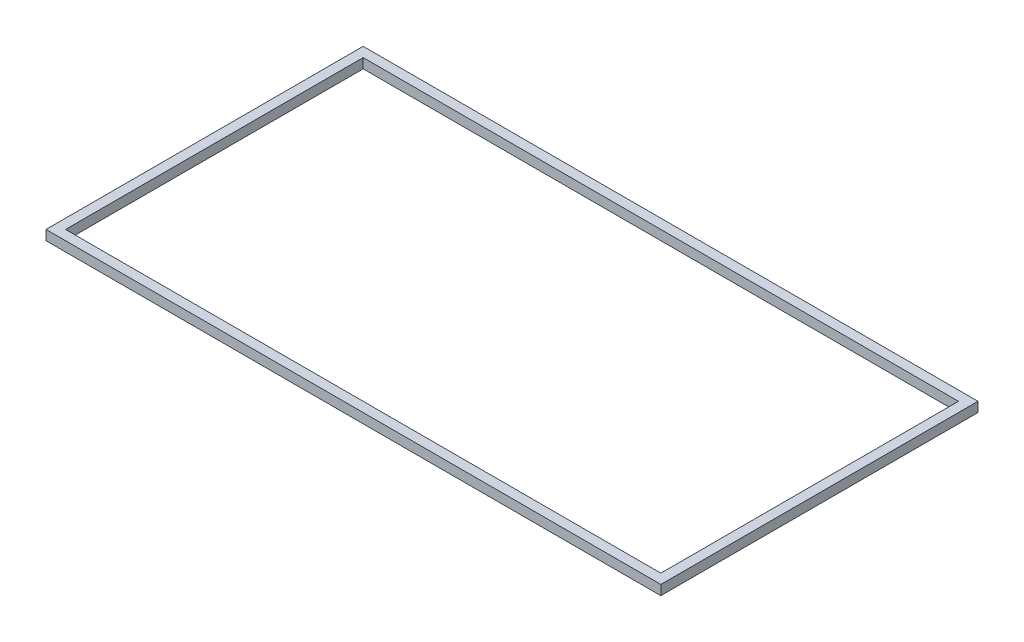
ISO-10303-21;
HEADER;
FILE_DESCRIPTION(('STEP AP214'),'2;1');
FILE_NAME('part.step','',(''),(''),'','','');
FILE_SCHEMA(('AUTOMOTIVE_DESIGN { 1 0 10303 214 1 1 1 1 }'));
ENDSEC;
DATA;
#1=APPLICATION_CONTEXT('core data for automotive mechanical design processes');
#2=APPLICATION_PROTOCOL_DEFINITION('international standard','automotive_design',2000,#1);
#3=PRODUCT_CONTEXT('',#1,'mechanical');
#4=PRODUCT('Part','Part','',(#3));
#5=PRODUCT_RELATED_PRODUCT_CATEGORY('part','',(#4));
#6=PRODUCT_DEFINITION_FORMATION('','',#4);
#7=PRODUCT_DEFINITION_CONTEXT('part definition',#1,'design');
#8=PRODUCT_DEFINITION('design','',#6,#7);
#9=PRODUCT_DEFINITION_SHAPE('','',#8);
#10=(LENGTH_UNIT() NAMED_UNIT(*) SI_UNIT(.MILLI.,.METRE.));
#11=(NAMED_UNIT(*) PLANE_ANGLE_UNIT() SI_UNIT($,.RADIAN.));
#12=(NAMED_UNIT(*) SI_UNIT($,.STERADIAN.) SOLID_ANGLE_UNIT());
#13=UNCERTAINTY_MEASURE_WITH_UNIT(LENGTH_MEASURE(1.E-05),#10,'distance_accuracy_value','');
#14=(GEOMETRIC_REPRESENTATION_CONTEXT(3) GLOBAL_UNCERTAINTY_ASSIGNED_CONTEXT((#13)) GLOBAL_UNIT_ASSIGNED_CONTEXT((#10,
#11,#12)) REPRESENTATION_CONTEXT('',''));
#15=CARTESIAN_POINT('',(0.,0.,0.));
#16=DIRECTION('',(0.,0.,1.));
#17=DIRECTION('',(1.,0.,0.));
#18=AXIS2_PLACEMENT_3D('',#15,#16,#17);
#19=CARTESIAN_POINT('',(0.,10.,0.));
#20=DIRECTION('',(0.,1.,0.));
#21=DIRECTION('',(0.,0.,1.));
#22=AXIS2_PLACEMENT_3D('',#19,#20,#21);
#23=PLANE('',#22);
#24=DIRECTION('',(0.,0.,-1.));
#25=VECTOR('',#24,1.);
#26=CARTESIAN_POINT('',(314.8,10.,0.));
#27=LINE('',#26,#25);
#28=CARTESIAN_POINT('',(314.8,10.,162.4));
#29=VERTEX_POINT('',#28);
#30=CARTESIAN_POINT('',(314.8,10.,-162.4));
#31=VERTEX_POINT('',#30);
#32=EDGE_CURVE('E182',#29,#31,#27,.T.);
#33=ORIENTED_EDGE('',*,*,#32,.T.);
#34=DIRECTION('',(-1.,0.,0.));
#35=VECTOR('',#34,1.);
#36=CARTESIAN_POINT('',(0.,10.,-162.4));
#37=LINE('',#36,#35);
#38=CARTESIAN_POINT('',(-314.8,10.,-162.4));
#39=VERTEX_POINT('',#38);
#40=EDGE_CURVE('E186',#31,#39,#37,.T.);
#41=ORIENTED_EDGE('',*,*,#40,.T.);
#42=DIRECTION('',(0.,0.,1.));
#43=VECTOR('',#42,1.);
#44=CARTESIAN_POINT('',(-314.8,10.,0.));
#45=LINE('',#44,#43);
#46=CARTESIAN_POINT('',(-314.8,10.,162.4));
#47=VERTEX_POINT('',#46);
#48=EDGE_CURVE('E190',#39,#47,#45,.T.);
#49=ORIENTED_EDGE('',*,*,#48,.T.);
#50=DIRECTION('',(1.,0.,0.));
#51=VECTOR('',#50,1.);
#52=CARTESIAN_POINT('',(0.,10.,162.4));
#53=LINE('',#52,#51);
#54=EDGE_CURVE('E193',#47,#29,#53,.T.);
#55=ORIENTED_EDGE('',*,*,#54,.T.);
#56=EDGE_LOOP('',(#33,#41,#49,#55));
#57=FACE_BOUND('',#56,.T.);
#58=DIRECTION('',(-1.,0.,0.));
#59=VECTOR('',#58,1.);
#60=CARTESIAN_POINT('',(-304.8,10.,-152.4));
#61=LINE('',#60,#59);
#62=CARTESIAN_POINT('',(304.8,10.,-152.4));
#63=VERTEX_POINT('',#62);
#64=CARTESIAN_POINT('',(-304.8,10.,-152.4));
#65=VERTEX_POINT('',#64);
#66=EDGE_CURVE('E143',#63,#65,#61,.T.);
#67=ORIENTED_EDGE('',*,*,#66,.F.);
#68=DIRECTION('',(0.,0.,-1.));
#69=VECTOR('',#68,1.);
#70=CARTESIAN_POINT('',(304.8,10.,152.4));
#71=LINE('',#70,#69);
#72=CARTESIAN_POINT('',(304.8,10.,152.4));
#73=VERTEX_POINT('',#72);
#74=EDGE_CURVE('E134',#73,#63,#71,.T.);
#75=ORIENTED_EDGE('',*,*,#74,.F.);
#76=DIRECTION('',(1.,0.,0.));
#77=VECTOR('',#76,1.);
#78=CARTESIAN_POINT('',(-304.8,10.,152.4));
#79=LINE('',#78,#77);
#80=CARTESIAN_POINT('',(-304.8,10.,152.4));
#81=VERTEX_POINT('',#80);
#82=EDGE_CURVE('E160',#81,#73,#79,.T.);
#83=ORIENTED_EDGE('',*,*,#82,.F.);
#84=DIRECTION('',(0.,0.,1.));
#85=VECTOR('',#84,1.);
#86=CARTESIAN_POINT('',(-304.8,10.,152.4));
#87=LINE('',#86,#85);
#88=EDGE_CURVE('E156',#65,#81,#87,.T.);
#89=ORIENTED_EDGE('',*,*,#88,.F.);
#90=EDGE_LOOP('',(#67,#75,#83,#89));
#91=FACE_BOUND('',#90,.T.);
#92=ADVANCED_FACE('F65',(#57,#91),#23,.T.);
#93=CARTESIAN_POINT('',(0.,0.,0.));
#94=DIRECTION('',(0.,1.,0.));
#95=DIRECTION('',(0.,0.,1.));
#96=AXIS2_PLACEMENT_3D('',#93,#94,#95);
#97=PLANE('',#96);
#98=DIRECTION('',(0.,0.,-1.));
#99=VECTOR('',#98,1.);
#100=CARTESIAN_POINT('',(314.8,0.,0.));
#101=LINE('',#100,#99);
#102=CARTESIAN_POINT('',(314.8,0.,162.4));
#103=VERTEX_POINT('',#102);
#104=CARTESIAN_POINT('',(314.8,0.,-162.4));
#105=VERTEX_POINT('',#104);
#106=EDGE_CURVE('E152',#103,#105,#101,.T.);
#107=ORIENTED_EDGE('',*,*,#106,.F.);
#108=DIRECTION('',(1.,0.,0.));
#109=VECTOR('',#108,1.);
#110=CARTESIAN_POINT('',(0.,0.,162.4));
#111=LINE('',#110,#109);
#112=CARTESIAN_POINT('',(-314.8,0.,162.4));
#113=VERTEX_POINT('',#112);
#114=EDGE_CURVE('E187',#113,#103,#111,.T.);
#115=ORIENTED_EDGE('',*,*,#114,.F.);
#116=DIRECTION('',(0.,0.,1.));
#117=VECTOR('',#116,1.);
#118=CARTESIAN_POINT('',(-314.8,0.,0.));
#119=LINE('',#118,#117);
#120=CARTESIAN_POINT('',(-314.8,0.,-162.4));
#121=VERTEX_POINT('',#120);
#122=EDGE_CURVE('E203',#121,#113,#119,.T.);
#123=ORIENTED_EDGE('',*,*,#122,.F.);
#124=DIRECTION('',(-1.,0.,0.));
#125=VECTOR('',#124,1.);
#126=CARTESIAN_POINT('',(0.,0.,-162.4));
#127=LINE('',#126,#125);
#128=EDGE_CURVE('E200',#105,#121,#127,.T.);
#129=ORIENTED_EDGE('',*,*,#128,.F.);
#130=EDGE_LOOP('',(#107,#115,#123,#129));
#131=FACE_BOUND('',#130,.T.);
#132=DIRECTION('',(0.,0.,-1.));
#133=VECTOR('',#132,1.);
#134=CARTESIAN_POINT('',(304.8,0.,152.4));
#135=LINE('',#134,#133);
#136=CARTESIAN_POINT('',(304.8,0.,152.4));
#137=VERTEX_POINT('',#136);
#138=CARTESIAN_POINT('',(304.8,0.,-152.4));
#139=VERTEX_POINT('',#138);
#140=EDGE_CURVE('E91',#137,#139,#135,.T.);
#141=ORIENTED_EDGE('',*,*,#140,.T.);
#142=DIRECTION('',(-1.,0.,0.));
#143=VECTOR('',#142,1.);
#144=CARTESIAN_POINT('',(-304.8,0.,-152.4));
#145=LINE('',#144,#143);
#146=CARTESIAN_POINT('',(-304.8,0.,-152.4));
#147=VERTEX_POINT('',#146);
#148=EDGE_CURVE('E150',#139,#147,#145,.T.);
#149=ORIENTED_EDGE('',*,*,#148,.T.);
#150=DIRECTION('',(0.,0.,1.));
#151=VECTOR('',#150,1.);
#152=CARTESIAN_POINT('',(-304.8,0.,152.4));
#153=LINE('',#152,#151);
#154=CARTESIAN_POINT('',(-304.8,0.,152.4));
#155=VERTEX_POINT('',#154);
#156=EDGE_CURVE('E169',#147,#155,#153,.T.);
#157=ORIENTED_EDGE('',*,*,#156,.T.);
#158=DIRECTION('',(1.,0.,0.));
#159=VECTOR('',#158,1.);
#160=CARTESIAN_POINT('',(-304.8,0.,152.4));
#161=LINE('',#160,#159);
#162=EDGE_CURVE('E144',#155,#137,#161,.T.);
#163=ORIENTED_EDGE('',*,*,#162,.T.);
#164=EDGE_LOOP('',(#141,#149,#157,#163));
#165=FACE_BOUND('',#164,.T.);
#166=ADVANCED_FACE('F226',(#131,#165),#97,.F.);
#167=CARTESIAN_POINT('',(314.8,10.,0.));
#168=DIRECTION('',(-1.,0.,0.));
#169=DIRECTION('',(0.,0.,1.));
#170=AXIS2_PLACEMENT_3D('',#167,#168,#169);
#171=PLANE('',#170);
#172=ORIENTED_EDGE('',*,*,#106,.T.);
#173=DIRECTION('',(0.,-1.,0.));
#174=VECTOR('',#173,1.);
#175=CARTESIAN_POINT('',(314.8,10.,-162.4));
#176=LINE('',#175,#174);
#177=EDGE_CURVE('E12',#31,#105,#176,.T.);
#178=ORIENTED_EDGE('',*,*,#177,.F.);
#179=ORIENTED_EDGE('',*,*,#32,.F.);
#180=DIRECTION('',(0.,-1.,0.));
#181=VECTOR('',#180,1.);
#182=CARTESIAN_POINT('',(314.8,10.,162.4));
#183=LINE('',#182,#181);
#184=EDGE_CURVE('E196',#29,#103,#183,.T.);
#185=ORIENTED_EDGE('',*,*,#184,.T.);
#186=EDGE_LOOP('',(#172,#178,#179,#185));
#187=FACE_BOUND('',#186,.T.);
#188=ADVANCED_FACE('F67',(#187),#171,.F.);
#189=CARTESIAN_POINT('',(0.,10.,-162.4));
#190=DIRECTION('',(0.,0.,1.));
#191=DIRECTION('',(1.,0.,0.));
#192=AXIS2_PLACEMENT_3D('',#189,#190,#191);
#193=PLANE('',#192);
#194=ORIENTED_EDGE('',*,*,#128,.T.);
#195=DIRECTION('',(0.,-1.,0.));
#196=VECTOR('',#195,1.);
#197=CARTESIAN_POINT('',(-314.8,10.,-162.4));
#198=LINE('',#197,#196);
#199=EDGE_CURVE('E74',#39,#121,#198,.T.);
#200=ORIENTED_EDGE('',*,*,#199,.F.);
#201=ORIENTED_EDGE('',*,*,#40,.F.);
#202=ORIENTED_EDGE('',*,*,#177,.T.);
#203=EDGE_LOOP('',(#194,#200,#201,#202));
#204=FACE_BOUND('',#203,.T.);
#205=ADVANCED_FACE('F236',(#204),#193,.F.);
#206=CARTESIAN_POINT('',(-314.8,10.,0.));
#207=DIRECTION('',(1.,0.,0.));
#208=DIRECTION('',(0.,0.,-1.));
#209=AXIS2_PLACEMENT_3D('',#206,#207,#208);
#210=PLANE('',#209);
#211=ORIENTED_EDGE('',*,*,#122,.T.);
#212=DIRECTION('',(0.,-1.,0.));
#213=VECTOR('',#212,1.);
#214=CARTESIAN_POINT('',(-314.8,10.,162.4));
#215=LINE('',#214,#213);
#216=EDGE_CURVE('E211',#47,#113,#215,.T.);
#217=ORIENTED_EDGE('',*,*,#216,.F.);
#218=ORIENTED_EDGE('',*,*,#48,.F.);
#219=ORIENTED_EDGE('',*,*,#199,.T.);
#220=EDGE_LOOP('',(#211,#217,#218,#219));
#221=FACE_BOUND('',#220,.T.);
#222=ADVANCED_FACE('F220',(#221),#210,.F.);
#223=CARTESIAN_POINT('',(0.,10.,162.4));
#224=DIRECTION('',(0.,0.,-1.));
#225=DIRECTION('',(-1.,0.,0.));
#226=AXIS2_PLACEMENT_3D('',#223,#224,#225);
#227=PLANE('',#226);
#228=ORIENTED_EDGE('',*,*,#114,.T.);
#229=ORIENTED_EDGE('',*,*,#184,.F.);
#230=ORIENTED_EDGE('',*,*,#54,.F.);
#231=ORIENTED_EDGE('',*,*,#216,.T.);
#232=EDGE_LOOP('',(#228,#229,#230,#231));
#233=FACE_BOUND('',#232,.T.);
#234=ADVANCED_FACE('F230',(#233),#227,.F.);
#235=CARTESIAN_POINT('',(304.8,10.,152.4));
#236=DIRECTION('',(-1.,0.,0.));
#237=DIRECTION('',(0.,0.,1.));
#238=AXIS2_PLACEMENT_3D('',#235,#236,#237);
#239=PLANE('',#238);
#240=ORIENTED_EDGE('',*,*,#140,.F.);
#241=DIRECTION('',(0.,-1.,0.));
#242=VECTOR('',#241,1.);
#243=CARTESIAN_POINT('',(304.8,10.,152.4));
#244=LINE('',#243,#242);
#245=EDGE_CURVE('E138',#73,#137,#244,.T.);
#246=ORIENTED_EDGE('',*,*,#245,.F.);
#247=ORIENTED_EDGE('',*,*,#74,.T.);
#248=DIRECTION('',(0.,-1.,0.));
#249=VECTOR('',#248,1.);
#250=CARTESIAN_POINT('',(304.8,10.,-152.4));
#251=LINE('',#250,#249);
#252=EDGE_CURVE('E137',#63,#139,#251,.T.);
#253=ORIENTED_EDGE('',*,*,#252,.T.);
#254=EDGE_LOOP('',(#240,#246,#247,#253));
#255=FACE_BOUND('',#254,.T.);
#256=ADVANCED_FACE('F136',(#255),#239,.T.);
#257=CARTESIAN_POINT('',(-304.8,10.,-152.4));
#258=DIRECTION('',(0.,0.,1.));
#259=DIRECTION('',(1.,0.,0.));
#260=AXIS2_PLACEMENT_3D('',#257,#258,#259);
#261=PLANE('',#260);
#262=ORIENTED_EDGE('',*,*,#148,.F.);
#263=ORIENTED_EDGE('',*,*,#252,.F.);
#264=ORIENTED_EDGE('',*,*,#66,.T.);
#265=DIRECTION('',(0.,-1.,0.));
#266=VECTOR('',#265,1.);
#267=CARTESIAN_POINT('',(-304.8,10.,-152.4));
#268=LINE('',#267,#266);
#269=EDGE_CURVE('E153',#65,#147,#268,.T.);
#270=ORIENTED_EDGE('',*,*,#269,.T.);
#271=EDGE_LOOP('',(#262,#263,#264,#270));
#272=FACE_BOUND('',#271,.T.);
#273=ADVANCED_FACE('F147',(#272),#261,.T.);
#274=CARTESIAN_POINT('',(-304.8,10.,152.4));
#275=DIRECTION('',(1.,0.,0.));
#276=DIRECTION('',(0.,0.,-1.));
#277=AXIS2_PLACEMENT_3D('',#274,#275,#276);
#278=PLANE('',#277);
#279=ORIENTED_EDGE('',*,*,#156,.F.);
#280=ORIENTED_EDGE('',*,*,#269,.F.);
#281=ORIENTED_EDGE('',*,*,#88,.T.);
#282=DIRECTION('',(0.,-1.,0.));
#283=VECTOR('',#282,1.);
#284=CARTESIAN_POINT('',(-304.8,10.,152.4));
#285=LINE('',#284,#283);
#286=EDGE_CURVE('E83',#81,#155,#285,.T.);
#287=ORIENTED_EDGE('',*,*,#286,.T.);
#288=EDGE_LOOP('',(#279,#280,#281,#287));
#289=FACE_BOUND('',#288,.T.);
#290=ADVANCED_FACE('F259',(#289),#278,.T.);
#291=CARTESIAN_POINT('',(-304.8,10.,152.4));
#292=DIRECTION('',(0.,0.,-1.));
#293=DIRECTION('',(-1.,0.,0.));
#294=AXIS2_PLACEMENT_3D('',#291,#292,#293);
#295=PLANE('',#294);
#296=ORIENTED_EDGE('',*,*,#162,.F.);
#297=ORIENTED_EDGE('',*,*,#286,.F.);
#298=ORIENTED_EDGE('',*,*,#82,.T.);
#299=ORIENTED_EDGE('',*,*,#245,.T.);
#300=EDGE_LOOP('',(#296,#297,#298,#299));
#301=FACE_BOUND('',#300,.T.);
#302=ADVANCED_FACE('F263',(#301),#295,.T.);
#303=CLOSED_SHELL('',(#92,#166,#188,#205,#222,#234,#256,#273,#290,#302));
#304=MANIFOLD_SOLID_BREP('B2',#303);
#305=ADVANCED_BREP_SHAPE_REPRESENTATION('',(#18,#304),#14);
#306=SHAPE_DEFINITION_REPRESENTATION(#9,#305);
ENDSEC;
END-ISO-10303-21;
